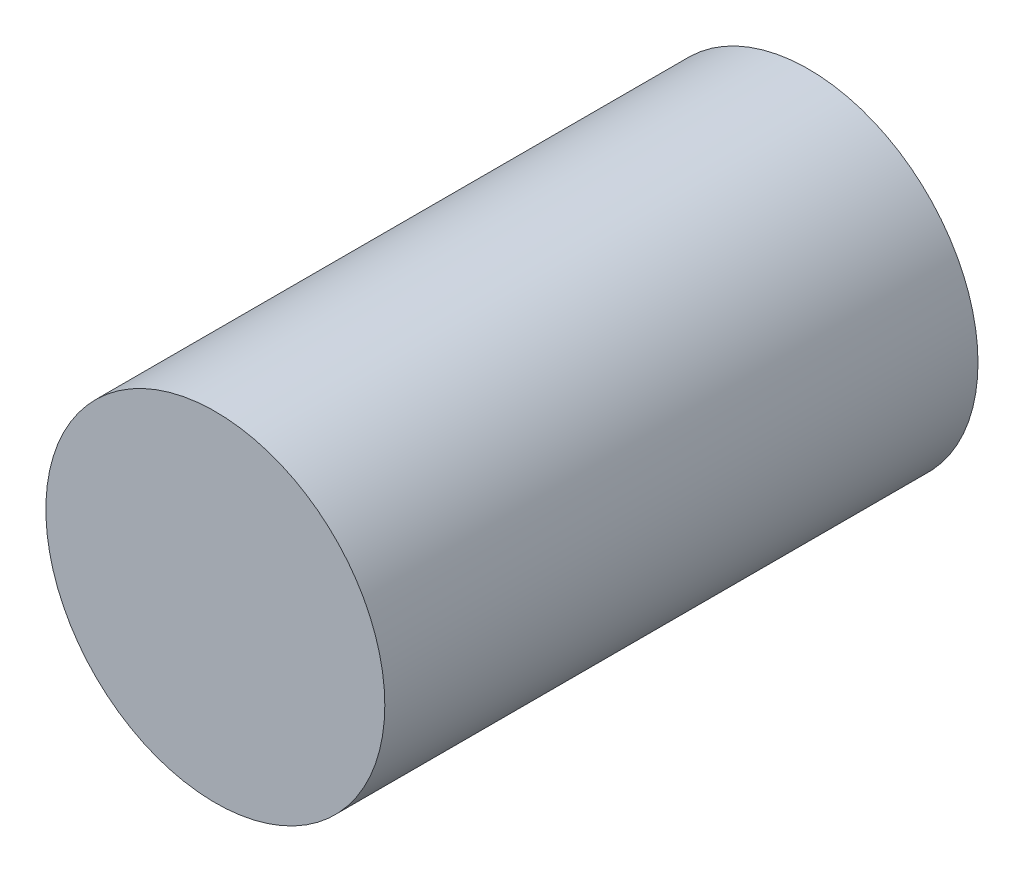
ISO-10303-21;
HEADER;
FILE_DESCRIPTION(('STEP AP214'),'2;1');
FILE_NAME('part.step','',(''),(''),'','','');
FILE_SCHEMA(('AUTOMOTIVE_DESIGN { 1 0 10303 214 1 1 1 1 }'));
ENDSEC;
DATA;
#1=APPLICATION_CONTEXT('core data for automotive mechanical design processes');
#2=APPLICATION_PROTOCOL_DEFINITION('international standard','automotive_design',2000,#1);
#3=PRODUCT_CONTEXT('',#1,'mechanical');
#4=PRODUCT('Part','Part','',(#3));
#5=PRODUCT_RELATED_PRODUCT_CATEGORY('part','',(#4));
#6=PRODUCT_DEFINITION_FORMATION('','',#4);
#7=PRODUCT_DEFINITION_CONTEXT('part definition',#1,'design');
#8=PRODUCT_DEFINITION('design','',#6,#7);
#9=PRODUCT_DEFINITION_SHAPE('','',#8);
#10=(LENGTH_UNIT() NAMED_UNIT(*) SI_UNIT(.MILLI.,.METRE.));
#11=(NAMED_UNIT(*) PLANE_ANGLE_UNIT() SI_UNIT($,.RADIAN.));
#12=(NAMED_UNIT(*) SI_UNIT($,.STERADIAN.) SOLID_ANGLE_UNIT());
#13=UNCERTAINTY_MEASURE_WITH_UNIT(LENGTH_MEASURE(1.E-05),#10,'distance_accuracy_value','');
#14=(GEOMETRIC_REPRESENTATION_CONTEXT(3) GLOBAL_UNCERTAINTY_ASSIGNED_CONTEXT((#13)) GLOBAL_UNIT_ASSIGNED_CONTEXT((#10,
#11,#12)) REPRESENTATION_CONTEXT('',''));
#15=CARTESIAN_POINT('',(0.,0.,0.));
#16=DIRECTION('',(0.,0.,1.));
#17=DIRECTION('',(1.,0.,0.));
#18=AXIS2_PLACEMENT_3D('',#15,#16,#17);
#19=CARTESIAN_POINT('',(2.,2.,7.));
#20=DIRECTION('',(0.,0.,-1.));
#21=DIRECTION('',(-1.,0.,0.));
#22=AXIS2_PLACEMENT_3D('',#19,#20,#21);
#23=CYLINDRICAL_SURFACE('',#22,2.);
#24=CARTESIAN_POINT('',(2.,2.,7.));
#25=DIRECTION('',(0.,0.,1.));
#26=DIRECTION('',(1.,0.,0.));
#27=AXIS2_PLACEMENT_3D('',#24,#25,#26);
#28=CIRCLE('',#27,2.);
#29=CARTESIAN_POINT('',(4.,2.,7.));
#30=VERTEX_POINT('',#29);
#31=EDGE_CURVE('E10',#30,#30,#28,.T.);
#32=ORIENTED_EDGE('',*,*,#31,.F.);
#33=EDGE_LOOP('',(#32));
#34=FACE_BOUND('',#33,.T.);
#35=CARTESIAN_POINT('',(2.,2.,0.));
#36=DIRECTION('',(0.,0.,1.));
#37=DIRECTION('',(1.,0.,0.));
#38=AXIS2_PLACEMENT_3D('',#35,#36,#37);
#39=CIRCLE('',#38,2.);
#40=CARTESIAN_POINT('',(4.,2.,0.));
#41=VERTEX_POINT('',#40);
#42=EDGE_CURVE('E42',#41,#41,#39,.T.);
#43=ORIENTED_EDGE('',*,*,#42,.T.);
#44=EDGE_LOOP('',(#43));
#45=FACE_BOUND('',#44,.T.);
#46=ADVANCED_FACE('F41',(#34,#45),#23,.T.);
#47=CARTESIAN_POINT('',(2.,2.,7.));
#48=DIRECTION('',(0.,0.,1.));
#49=DIRECTION('',(1.,0.,0.));
#50=AXIS2_PLACEMENT_3D('',#47,#48,#49);
#51=PLANE('',#50);
#52=ORIENTED_EDGE('',*,*,#31,.T.);
#53=EDGE_LOOP('',(#52));
#54=FACE_BOUND('',#53,.T.);
#55=ADVANCED_FACE('F57',(#54),#51,.T.);
#56=CARTESIAN_POINT('',(2.,2.,0.));
#57=DIRECTION('',(0.,0.,1.));
#58=DIRECTION('',(1.,0.,0.));
#59=AXIS2_PLACEMENT_3D('',#56,#57,#58);
#60=PLANE('',#59);
#61=ORIENTED_EDGE('',*,*,#42,.F.);
#62=EDGE_LOOP('',(#61));
#63=FACE_BOUND('',#62,.T.);
#64=ADVANCED_FACE('F53',(#63),#60,.F.);
#65=CLOSED_SHELL('',(#46,#55,#64));
#66=MANIFOLD_SOLID_BREP('B2',#65);
#67=ADVANCED_BREP_SHAPE_REPRESENTATION('',(#18,#66),#14);
#68=SHAPE_DEFINITION_REPRESENTATION(#9,#67);
ENDSEC;
END-ISO-10303-21;
